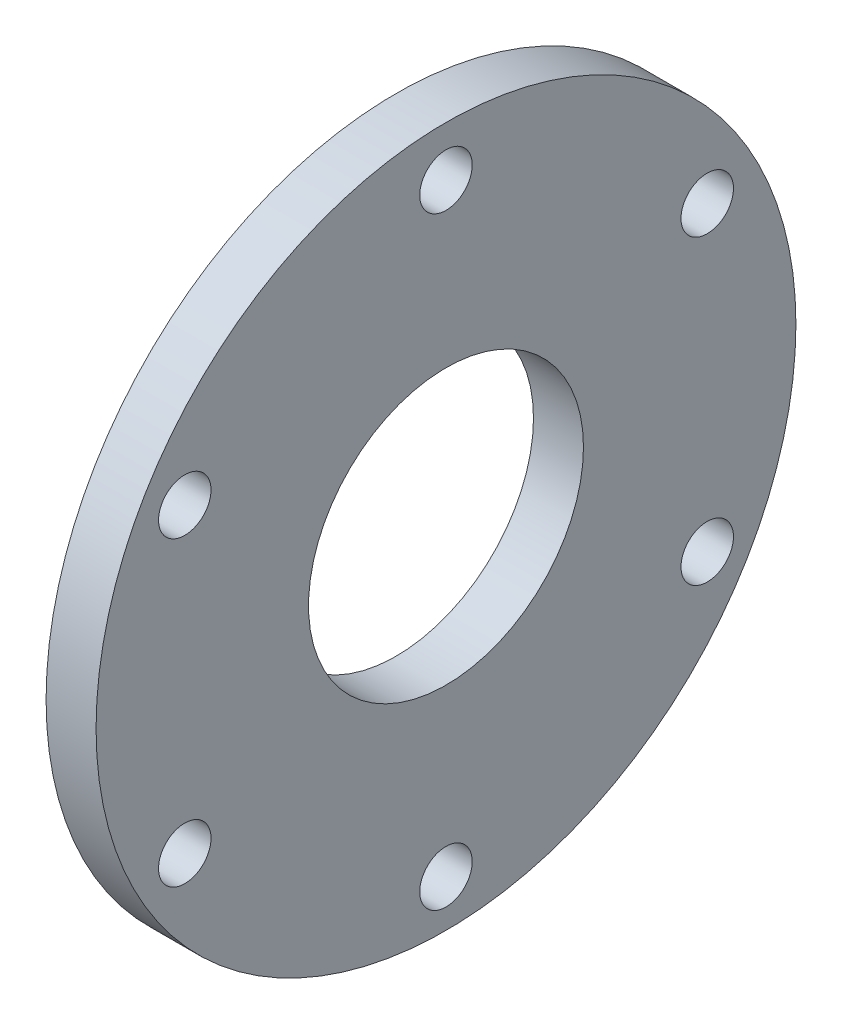
ISO-10303-21;
HEADER;
FILE_DESCRIPTION(('STEP AP214'),'2;1');
FILE_NAME('part.step','',(''),(''),'','','');
FILE_SCHEMA(('AUTOMOTIVE_DESIGN { 1 0 10303 214 1 1 1 1 }'));
ENDSEC;
DATA;
#1=APPLICATION_CONTEXT('core data for automotive mechanical design processes');
#2=APPLICATION_PROTOCOL_DEFINITION('international standard','automotive_design',2000,#1);
#3=PRODUCT_CONTEXT('',#1,'mechanical');
#4=PRODUCT('Part','Part','',(#3));
#5=PRODUCT_RELATED_PRODUCT_CATEGORY('part','',(#4));
#6=PRODUCT_DEFINITION_FORMATION('','',#4);
#7=PRODUCT_DEFINITION_CONTEXT('part definition',#1,'design');
#8=PRODUCT_DEFINITION('design','',#6,#7);
#9=PRODUCT_DEFINITION_SHAPE('','',#8);
#10=(LENGTH_UNIT() NAMED_UNIT(*) SI_UNIT(.MILLI.,.METRE.));
#11=(NAMED_UNIT(*) PLANE_ANGLE_UNIT() SI_UNIT($,.RADIAN.));
#12=(NAMED_UNIT(*) SI_UNIT($,.STERADIAN.) SOLID_ANGLE_UNIT());
#13=UNCERTAINTY_MEASURE_WITH_UNIT(LENGTH_MEASURE(1.E-05),#10,'distance_accuracy_value','');
#14=(GEOMETRIC_REPRESENTATION_CONTEXT(3) GLOBAL_UNCERTAINTY_ASSIGNED_CONTEXT((#13)) GLOBAL_UNIT_ASSIGNED_CONTEXT((#10,
#11,#12)) REPRESENTATION_CONTEXT('',''));
#15=CARTESIAN_POINT('',(0.,0.,0.));
#16=DIRECTION('',(0.,0.,1.));
#17=DIRECTION('',(1.,0.,0.));
#18=AXIS2_PLACEMENT_3D('',#15,#16,#17);
#19=CARTESIAN_POINT('',(10.,0.,0.));
#20=DIRECTION('',(-1.,0.,0.));
#21=DIRECTION('',(0.,0.,1.));
#22=AXIS2_PLACEMENT_3D('',#19,#20,#21);
#23=CYLINDRICAL_SURFACE('',#22,70.);
#24=CARTESIAN_POINT('',(10.,0.,0.));
#25=DIRECTION('',(1.,0.,0.));
#26=DIRECTION('',(0.,0.,-1.));
#27=AXIS2_PLACEMENT_3D('',#24,#25,#26);
#28=CIRCLE('',#27,70.);
#29=CARTESIAN_POINT('',(10.,0.,-70.));
#30=VERTEX_POINT('',#29);
#31=EDGE_CURVE('E10',#30,#30,#28,.T.);
#32=ORIENTED_EDGE('',*,*,#31,.F.);
#33=EDGE_LOOP('',(#32));
#34=FACE_BOUND('',#33,.T.);
#35=CARTESIAN_POINT('',(0.,0.,0.));
#36=DIRECTION('',(1.,0.,0.));
#37=DIRECTION('',(0.,0.,-1.));
#38=AXIS2_PLACEMENT_3D('',#35,#36,#37);
#39=CIRCLE('',#38,70.);
#40=CARTESIAN_POINT('',(0.,0.,-70.));
#41=VERTEX_POINT('',#40);
#42=EDGE_CURVE('E45',#41,#41,#39,.T.);
#43=ORIENTED_EDGE('',*,*,#42,.T.);
#44=EDGE_LOOP('',(#43));
#45=FACE_BOUND('',#44,.T.);
#46=ADVANCED_FACE('F37',(#34,#45),#23,.T.);
#47=CARTESIAN_POINT('',(10.,0.,0.));
#48=DIRECTION('',(1.,0.,0.));
#49=DIRECTION('',(0.,0.,-1.));
#50=AXIS2_PLACEMENT_3D('',#47,#48,#49);
#51=PLANE('',#50);
#52=CARTESIAN_POINT('',(10.,0.,0.));
#53=DIRECTION('',(1.,0.,0.));
#54=DIRECTION('',(0.,0.,-1.));
#55=AXIS2_PLACEMENT_3D('',#52,#53,#54);
#56=CIRCLE('',#55,27.5);
#57=CARTESIAN_POINT('',(10.,0.,-27.5));
#58=VERTEX_POINT('',#57);
#59=EDGE_CURVE('E152',#58,#58,#56,.T.);
#60=ORIENTED_EDGE('',*,*,#59,.F.);
#61=EDGE_LOOP('',(#60));
#62=FACE_BOUND('',#61,.T.);
#63=CARTESIAN_POINT('',(10.,29.8302954116914,-52.2554611962951));
#64=DIRECTION('',(1.,0.,0.));
#65=DIRECTION('',(0.,0.,-1.));
#66=AXIS2_PLACEMENT_3D('',#63,#64,#65);
#67=CIRCLE('',#66,5.25);
#68=CARTESIAN_POINT('',(10.,29.8302954116914,-57.5054611962951));
#69=VERTEX_POINT('',#68);
#70=EDGE_CURVE('E83',#69,#69,#67,.T.);
#71=ORIENTED_EDGE('',*,*,#70,.F.);
#72=EDGE_LOOP('',(#71));
#73=FACE_BOUND('',#72,.T.);
#74=CARTESIAN_POINT('',(10.,-30.5091137649272,-52.2554611962958));
#75=DIRECTION('',(1.,0.,0.));
#76=DIRECTION('',(0.,0.,-1.));
#77=AXIS2_PLACEMENT_3D('',#74,#75,#76);
#78=CIRCLE('',#77,5.24999999999999);
#79=CARTESIAN_POINT('',(10.,-30.5091137649272,-57.5054611962958));
#80=VERTEX_POINT('',#79);
#81=EDGE_CURVE('E69',#80,#80,#78,.T.);
#82=ORIENTED_EDGE('',*,*,#81,.F.);
#83=EDGE_LOOP('',(#82));
#84=FACE_BOUND('',#83,.T.);
#85=CARTESIAN_POINT('',(10.,-60.678818353237,0.));
#86=DIRECTION('',(1.,0.,0.));
#87=DIRECTION('',(0.,0.,-1.));
#88=AXIS2_PLACEMENT_3D('',#85,#86,#87);
#89=CIRCLE('',#88,5.25);
#90=CARTESIAN_POINT('',(10.,-60.678818353237,-5.25000000000003));
#91=VERTEX_POINT('',#90);
#92=EDGE_CURVE('E68',#91,#91,#89,.T.);
#93=ORIENTED_EDGE('',*,*,#92,.F.);
#94=EDGE_LOOP('',(#93));
#95=FACE_BOUND('',#94,.T.);
#96=CARTESIAN_POINT('',(10.,-30.509113764928,52.2554611962953));
#97=DIRECTION('',(1.,0.,0.));
#98=DIRECTION('',(0.,0.,-1.));
#99=AXIS2_PLACEMENT_3D('',#96,#97,#98);
#100=CIRCLE('',#99,5.24999999999999);
#101=CARTESIAN_POINT('',(10.,-30.509113764928,47.0054611962953));
#102=VERTEX_POINT('',#101);
#103=EDGE_CURVE('E64',#102,#102,#100,.T.);
#104=ORIENTED_EDGE('',*,*,#103,.F.);
#105=EDGE_LOOP('',(#104));
#106=FACE_BOUND('',#105,.T.);
#107=CARTESIAN_POINT('',(10.,29.8302954116906,52.2554611962955));
#108=DIRECTION('',(1.,0.,0.));
#109=DIRECTION('',(0.,0.,-1.));
#110=AXIS2_PLACEMENT_3D('',#107,#108,#109);
#111=CIRCLE('',#110,5.25);
#112=CARTESIAN_POINT('',(10.,29.8302954116906,47.0054611962955));
#113=VERTEX_POINT('',#112);
#114=EDGE_CURVE('E63',#113,#113,#111,.T.);
#115=ORIENTED_EDGE('',*,*,#114,.F.);
#116=EDGE_LOOP('',(#115));
#117=FACE_BOUND('',#116,.T.);
#118=CARTESIAN_POINT('',(10.,60.,0.));
#119=DIRECTION('',(1.,0.,0.));
#120=DIRECTION('',(0.,0.,-1.));
#121=AXIS2_PLACEMENT_3D('',#118,#119,#120);
#122=CIRCLE('',#121,5.24999999999999);
#123=CARTESIAN_POINT('',(10.,60.,-5.24999999999999));
#124=VERTEX_POINT('',#123);
#125=EDGE_CURVE('E54',#124,#124,#122,.T.);
#126=ORIENTED_EDGE('',*,*,#125,.F.);
#127=EDGE_LOOP('',(#126));
#128=FACE_BOUND('',#127,.T.);
#129=ORIENTED_EDGE('',*,*,#31,.T.);
#130=EDGE_LOOP('',(#129));
#131=FACE_BOUND('',#130,.T.);
#132=ADVANCED_FACE('F107',(#62,#73,#84,#95,#106,#117,#128,#131),#51,.T.);
#133=CARTESIAN_POINT('',(0.,0.,0.));
#134=DIRECTION('',(1.,0.,0.));
#135=DIRECTION('',(0.,0.,-1.));
#136=AXIS2_PLACEMENT_3D('',#133,#134,#135);
#137=PLANE('',#136);
#138=CARTESIAN_POINT('',(0.,0.,0.));
#139=DIRECTION('',(1.,0.,0.));
#140=DIRECTION('',(0.,0.,-1.));
#141=AXIS2_PLACEMENT_3D('',#138,#139,#140);
#142=CIRCLE('',#141,27.5);
#143=CARTESIAN_POINT('',(0.,0.,-27.5));
#144=VERTEX_POINT('',#143);
#145=EDGE_CURVE('E150',#144,#144,#142,.T.);
#146=ORIENTED_EDGE('',*,*,#145,.T.);
#147=EDGE_LOOP('',(#146));
#148=FACE_BOUND('',#147,.T.);
#149=CARTESIAN_POINT('',(0.,29.8302954116914,-52.2554611962951));
#150=DIRECTION('',(1.,0.,0.));
#151=DIRECTION('',(0.,0.,-1.));
#152=AXIS2_PLACEMENT_3D('',#149,#150,#151);
#153=CIRCLE('',#152,5.24999999999999);
#154=CARTESIAN_POINT('',(0.,29.8302954116914,-57.5054611962951));
#155=VERTEX_POINT('',#154);
#156=EDGE_CURVE('E40',#155,#155,#153,.T.);
#157=ORIENTED_EDGE('',*,*,#156,.T.);
#158=EDGE_LOOP('',(#157));
#159=FACE_BOUND('',#158,.T.);
#160=CARTESIAN_POINT('',(0.,-30.5091137649272,-52.2554611962958));
#161=DIRECTION('',(1.,0.,0.));
#162=DIRECTION('',(0.,0.,-1.));
#163=AXIS2_PLACEMENT_3D('',#160,#161,#162);
#164=CIRCLE('',#163,5.24999999999999);
#165=CARTESIAN_POINT('',(0.,-30.5091137649272,-57.5054611962958));
#166=VERTEX_POINT('',#165);
#167=EDGE_CURVE('E65',#166,#166,#164,.T.);
#168=ORIENTED_EDGE('',*,*,#167,.T.);
#169=EDGE_LOOP('',(#168));
#170=FACE_BOUND('',#169,.T.);
#171=CARTESIAN_POINT('',(0.,-60.678818353237,0.));
#172=DIRECTION('',(1.,0.,0.));
#173=DIRECTION('',(0.,0.,-1.));
#174=AXIS2_PLACEMENT_3D('',#171,#172,#173);
#175=CIRCLE('',#174,5.24999999999999);
#176=CARTESIAN_POINT('',(0.,-60.678818353237,-5.25000000000002));
#177=VERTEX_POINT('',#176);
#178=EDGE_CURVE('E75',#177,#177,#175,.T.);
#179=ORIENTED_EDGE('',*,*,#178,.T.);
#180=EDGE_LOOP('',(#179));
#181=FACE_BOUND('',#180,.T.);
#182=CARTESIAN_POINT('',(0.,-30.509113764928,52.2554611962953));
#183=DIRECTION('',(1.,0.,0.));
#184=DIRECTION('',(0.,0.,-1.));
#185=AXIS2_PLACEMENT_3D('',#182,#183,#184);
#186=CIRCLE('',#185,5.24999999999999);
#187=CARTESIAN_POINT('',(0.,-30.509113764928,47.0054611962953));
#188=VERTEX_POINT('',#187);
#189=EDGE_CURVE('E60',#188,#188,#186,.T.);
#190=ORIENTED_EDGE('',*,*,#189,.T.);
#191=EDGE_LOOP('',(#190));
#192=FACE_BOUND('',#191,.T.);
#193=CARTESIAN_POINT('',(0.,29.8302954116906,52.2554611962955));
#194=DIRECTION('',(1.,0.,0.));
#195=DIRECTION('',(0.,0.,-1.));
#196=AXIS2_PLACEMENT_3D('',#193,#194,#195);
#197=CIRCLE('',#196,5.24999999999999);
#198=CARTESIAN_POINT('',(0.,29.8302954116906,47.0054611962955));
#199=VERTEX_POINT('',#198);
#200=EDGE_CURVE('E95',#199,#199,#197,.T.);
#201=ORIENTED_EDGE('',*,*,#200,.T.);
#202=EDGE_LOOP('',(#201));
#203=FACE_BOUND('',#202,.T.);
#204=CARTESIAN_POINT('',(0.,60.,0.));
#205=DIRECTION('',(1.,0.,0.));
#206=DIRECTION('',(0.,0.,-1.));
#207=AXIS2_PLACEMENT_3D('',#204,#205,#206);
#208=CIRCLE('',#207,5.24999999999999);
#209=CARTESIAN_POINT('',(0.,60.,-5.24999999999999));
#210=VERTEX_POINT('',#209);
#211=EDGE_CURVE('E51',#210,#210,#208,.T.);
#212=ORIENTED_EDGE('',*,*,#211,.T.);
#213=EDGE_LOOP('',(#212));
#214=FACE_BOUND('',#213,.T.);
#215=ORIENTED_EDGE('',*,*,#42,.F.);
#216=EDGE_LOOP('',(#215));
#217=FACE_BOUND('',#216,.T.);
#218=ADVANCED_FACE('F109',(#148,#159,#170,#181,#192,#203,#214,#217),#137,.F.);
#219=CARTESIAN_POINT('',(10.,60.,0.));
#220=DIRECTION('',(1.,0.,0.));
#221=DIRECTION('',(0.,0.,-1.));
#222=AXIS2_PLACEMENT_3D('',#219,#220,#221);
#223=CYLINDRICAL_SURFACE('',#222,5.24999999999999);
#224=ORIENTED_EDGE('',*,*,#125,.T.);
#225=EDGE_LOOP('',(#224));
#226=FACE_BOUND('',#225,.T.);
#227=ORIENTED_EDGE('',*,*,#211,.F.);
#228=EDGE_LOOP('',(#227));
#229=FACE_BOUND('',#228,.T.);
#230=ADVANCED_FACE('F104',(#226,#229),#223,.F.);
#231=CARTESIAN_POINT('',(10.,29.8302954116906,52.2554611962955));
#232=DIRECTION('',(1.,0.,0.));
#233=DIRECTION('',(0.,0.,-1.));
#234=AXIS2_PLACEMENT_3D('',#231,#232,#233);
#235=CYLINDRICAL_SURFACE('',#234,5.24999999999999);
#236=ORIENTED_EDGE('',*,*,#114,.T.);
#237=EDGE_LOOP('',(#236));
#238=FACE_BOUND('',#237,.T.);
#239=ORIENTED_EDGE('',*,*,#200,.F.);
#240=EDGE_LOOP('',(#239));
#241=FACE_BOUND('',#240,.T.);
#242=ADVANCED_FACE('F123',(#238,#241),#235,.F.);
#243=CARTESIAN_POINT('',(10.,-30.509113764928,52.2554611962953));
#244=DIRECTION('',(1.,0.,0.));
#245=DIRECTION('',(0.,0.,-1.));
#246=AXIS2_PLACEMENT_3D('',#243,#244,#245);
#247=CYLINDRICAL_SURFACE('',#246,5.24999999999999);
#248=ORIENTED_EDGE('',*,*,#103,.T.);
#249=EDGE_LOOP('',(#248));
#250=FACE_BOUND('',#249,.T.);
#251=ORIENTED_EDGE('',*,*,#189,.F.);
#252=EDGE_LOOP('',(#251));
#253=FACE_BOUND('',#252,.T.);
#254=ADVANCED_FACE('F126',(#250,#253),#247,.F.);
#255=CARTESIAN_POINT('',(10.,-60.678818353237,0.));
#256=DIRECTION('',(1.,0.,0.));
#257=DIRECTION('',(0.,0.,-1.));
#258=AXIS2_PLACEMENT_3D('',#255,#256,#257);
#259=CYLINDRICAL_SURFACE('',#258,5.24999999999999);
#260=ORIENTED_EDGE('',*,*,#92,.T.);
#261=EDGE_LOOP('',(#260));
#262=FACE_BOUND('',#261,.T.);
#263=ORIENTED_EDGE('',*,*,#178,.F.);
#264=EDGE_LOOP('',(#263));
#265=FACE_BOUND('',#264,.T.);
#266=ADVANCED_FACE('F130',(#262,#265),#259,.F.);
#267=CARTESIAN_POINT('',(10.,-30.5091137649272,-52.2554611962958));
#268=DIRECTION('',(1.,0.,0.));
#269=DIRECTION('',(0.,0.,-1.));
#270=AXIS2_PLACEMENT_3D('',#267,#268,#269);
#271=CYLINDRICAL_SURFACE('',#270,5.24999999999999);
#272=ORIENTED_EDGE('',*,*,#81,.T.);
#273=EDGE_LOOP('',(#272));
#274=FACE_BOUND('',#273,.T.);
#275=ORIENTED_EDGE('',*,*,#167,.F.);
#276=EDGE_LOOP('',(#275));
#277=FACE_BOUND('',#276,.T.);
#278=ADVANCED_FACE('F134',(#274,#277),#271,.F.);
#279=CARTESIAN_POINT('',(10.,29.8302954116914,-52.2554611962951));
#280=DIRECTION('',(1.,0.,0.));
#281=DIRECTION('',(0.,0.,-1.));
#282=AXIS2_PLACEMENT_3D('',#279,#280,#281);
#283=CYLINDRICAL_SURFACE('',#282,5.24999999999999);
#284=ORIENTED_EDGE('',*,*,#70,.T.);
#285=EDGE_LOOP('',(#284));
#286=FACE_BOUND('',#285,.T.);
#287=ORIENTED_EDGE('',*,*,#156,.F.);
#288=EDGE_LOOP('',(#287));
#289=FACE_BOUND('',#288,.T.);
#290=ADVANCED_FACE('F138',(#286,#289),#283,.F.);
#291=CARTESIAN_POINT('',(0.,0.,0.));
#292=DIRECTION('',(1.,0.,0.));
#293=DIRECTION('',(0.,0.,-1.));
#294=AXIS2_PLACEMENT_3D('',#291,#292,#293);
#295=CYLINDRICAL_SURFACE('',#294,27.5);
#296=ORIENTED_EDGE('',*,*,#145,.F.);
#297=EDGE_LOOP('',(#296));
#298=FACE_BOUND('',#297,.T.);
#299=ORIENTED_EDGE('',*,*,#59,.T.);
#300=EDGE_LOOP('',(#299));
#301=FACE_BOUND('',#300,.T.);
#302=ADVANCED_FACE('F141',(#298,#301),#295,.F.);
#303=CLOSED_SHELL('',(#46,#132,#218,#230,#242,#254,#266,#278,#290,#302));
#304=MANIFOLD_SOLID_BREP('B2',#303);
#305=ADVANCED_BREP_SHAPE_REPRESENTATION('',(#18,#304),#14);
#306=SHAPE_DEFINITION_REPRESENTATION(#9,#305);
ENDSEC;
END-ISO-10303-21;
